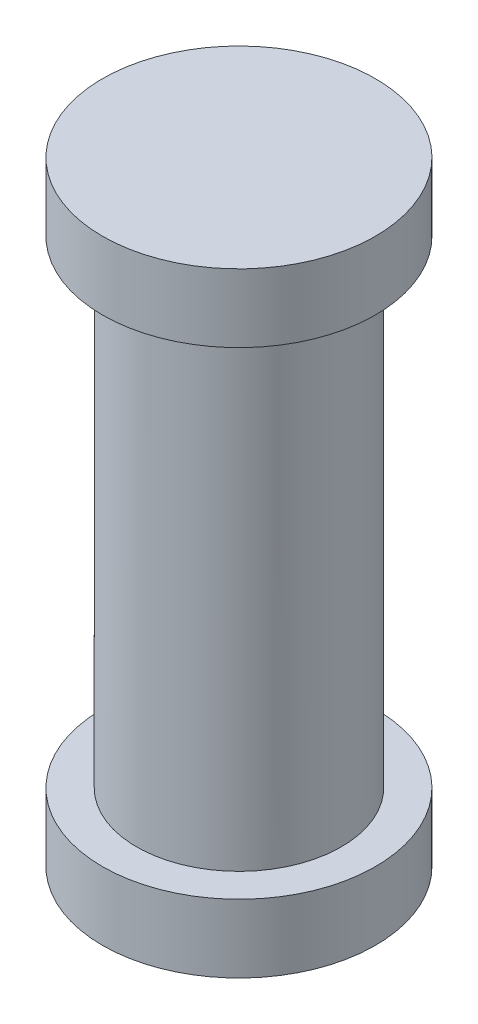
ISO-10303-21;
HEADER;
FILE_DESCRIPTION(('STEP AP214'),'2;1');
FILE_NAME('part.step','',(''),(''),'','','');
FILE_SCHEMA(('AUTOMOTIVE_DESIGN { 1 0 10303 214 1 1 1 1 }'));
ENDSEC;
DATA;
#1=APPLICATION_CONTEXT('core data for automotive mechanical design processes');
#2=APPLICATION_PROTOCOL_DEFINITION('international standard','automotive_design',2000,#1);
#3=PRODUCT_CONTEXT('',#1,'mechanical');
#4=PRODUCT('Part','Part','',(#3));
#5=PRODUCT_RELATED_PRODUCT_CATEGORY('part','',(#4));
#6=PRODUCT_DEFINITION_FORMATION('','',#4);
#7=PRODUCT_DEFINITION_CONTEXT('part definition',#1,'design');
#8=PRODUCT_DEFINITION('design','',#6,#7);
#9=PRODUCT_DEFINITION_SHAPE('','',#8);
#10=(LENGTH_UNIT() NAMED_UNIT(*) SI_UNIT(.MILLI.,.METRE.));
#11=(NAMED_UNIT(*) PLANE_ANGLE_UNIT() SI_UNIT($,.RADIAN.));
#12=(NAMED_UNIT(*) SI_UNIT($,.STERADIAN.) SOLID_ANGLE_UNIT());
#13=UNCERTAINTY_MEASURE_WITH_UNIT(LENGTH_MEASURE(1.E-05),#10,'distance_accuracy_value','');
#14=(GEOMETRIC_REPRESENTATION_CONTEXT(3) GLOBAL_UNCERTAINTY_ASSIGNED_CONTEXT((#13)) GLOBAL_UNIT_ASSIGNED_CONTEXT((#10,
#11,#12)) REPRESENTATION_CONTEXT('',''));
#15=CARTESIAN_POINT('',(0.,0.,0.));
#16=DIRECTION('',(0.,0.,1.));
#17=DIRECTION('',(1.,0.,0.));
#18=AXIS2_PLACEMENT_3D('',#15,#16,#17);
#19=CARTESIAN_POINT('',(0.,7.,0.));
#20=DIRECTION('',(0.,-1.,0.));
#21=DIRECTION('',(0.,0.,-1.));
#22=AXIS2_PLACEMENT_3D('',#19,#20,#21);
#23=CYLINDRICAL_SURFACE('',#22,3.);
#24=CARTESIAN_POINT('',(0.,7.,0.));
#25=DIRECTION('',(0.,1.,0.));
#26=DIRECTION('',(0.,0.,1.));
#27=AXIS2_PLACEMENT_3D('',#24,#25,#26);
#28=CIRCLE('',#27,3.);
#29=CARTESIAN_POINT('',(0.,7.,3.));
#30=VERTEX_POINT('',#29);
#31=EDGE_CURVE('E10',#30,#30,#28,.T.);
#32=ORIENTED_EDGE('',*,*,#31,.F.);
#33=EDGE_LOOP('',(#32));
#34=FACE_BOUND('',#33,.T.);
#35=CARTESIAN_POINT('',(0.,-7.,0.));
#36=DIRECTION('',(0.,-1.,0.));
#37=DIRECTION('',(0.,0.,-1.));
#38=AXIS2_PLACEMENT_3D('',#35,#36,#37);
#39=CIRCLE('',#38,3.);
#40=CARTESIAN_POINT('',(0.,-7.,-3.));
#41=VERTEX_POINT('',#40);
#42=EDGE_CURVE('E46',#41,#41,#39,.T.);
#43=ORIENTED_EDGE('',*,*,#42,.F.);
#44=EDGE_LOOP('',(#43));
#45=FACE_BOUND('',#44,.T.);
#46=ADVANCED_FACE('F31',(#34,#45),#23,.T.);
#47=CARTESIAN_POINT('',(0.,7.,0.));
#48=DIRECTION('',(0.,1.,0.));
#49=DIRECTION('',(0.,0.,1.));
#50=AXIS2_PLACEMENT_3D('',#47,#48,#49);
#51=PLANE('',#50);
#52=CARTESIAN_POINT('',(0.,7.,0.));
#53=DIRECTION('',(0.,1.,0.));
#54=DIRECTION('',(0.,0.,1.));
#55=AXIS2_PLACEMENT_3D('',#52,#53,#54);
#56=CIRCLE('',#55,4.);
#57=CARTESIAN_POINT('',(0.,7.,4.));
#58=VERTEX_POINT('',#57);
#59=EDGE_CURVE('E41',#58,#58,#56,.T.);
#60=ORIENTED_EDGE('',*,*,#59,.F.);
#61=EDGE_LOOP('',(#60));
#62=FACE_BOUND('',#61,.T.);
#63=ORIENTED_EDGE('',*,*,#31,.T.);
#64=EDGE_LOOP('',(#63));
#65=FACE_BOUND('',#64,.T.);
#66=ADVANCED_FACE('F70',(#62,#65),#51,.F.);
#67=CARTESIAN_POINT('',(0.,9.,0.));
#68=DIRECTION('',(0.,-1.,0.));
#69=DIRECTION('',(0.,0.,-1.));
#70=AXIS2_PLACEMENT_3D('',#67,#68,#69);
#71=CYLINDRICAL_SURFACE('',#70,4.);
#72=CARTESIAN_POINT('',(0.,9.,0.));
#73=DIRECTION('',(0.,1.,0.));
#74=DIRECTION('',(0.,0.,1.));
#75=AXIS2_PLACEMENT_3D('',#72,#73,#74);
#76=CIRCLE('',#75,4.);
#77=CARTESIAN_POINT('',(0.,9.,4.));
#78=VERTEX_POINT('',#77);
#79=EDGE_CURVE('E37',#78,#78,#76,.T.);
#80=ORIENTED_EDGE('',*,*,#79,.F.);
#81=EDGE_LOOP('',(#80));
#82=FACE_BOUND('',#81,.T.);
#83=ORIENTED_EDGE('',*,*,#59,.T.);
#84=EDGE_LOOP('',(#83));
#85=FACE_BOUND('',#84,.T.);
#86=ADVANCED_FACE('F75',(#82,#85),#71,.T.);
#87=CARTESIAN_POINT('',(0.,9.,0.));
#88=DIRECTION('',(0.,1.,0.));
#89=DIRECTION('',(0.,0.,1.));
#90=AXIS2_PLACEMENT_3D('',#87,#88,#89);
#91=PLANE('',#90);
#92=ORIENTED_EDGE('',*,*,#79,.T.);
#93=EDGE_LOOP('',(#92));
#94=FACE_BOUND('',#93,.T.);
#95=ADVANCED_FACE('F82',(#94),#91,.T.);
#96=CARTESIAN_POINT('',(0.,-7.,0.));
#97=DIRECTION('',(0.,-1.,0.));
#98=DIRECTION('',(0.,0.,1.));
#99=AXIS2_PLACEMENT_3D('',#96,#97,#98);
#100=PLANE('',#99);
#101=CARTESIAN_POINT('',(0.,-7.,0.));
#102=DIRECTION('',(0.,1.,0.));
#103=DIRECTION('',(0.,0.,1.));
#104=AXIS2_PLACEMENT_3D('',#101,#102,#103);
#105=CIRCLE('',#104,4.);
#106=CARTESIAN_POINT('',(0.,-7.,4.));
#107=VERTEX_POINT('',#106);
#108=EDGE_CURVE('E51',#107,#107,#105,.T.);
#109=ORIENTED_EDGE('',*,*,#108,.T.);
#110=EDGE_LOOP('',(#109));
#111=FACE_BOUND('',#110,.T.);
#112=ORIENTED_EDGE('',*,*,#42,.T.);
#113=EDGE_LOOP('',(#112));
#114=FACE_BOUND('',#113,.T.);
#115=ADVANCED_FACE('F66',(#111,#114),#100,.F.);
#116=CARTESIAN_POINT('',(0.,-9.,0.));
#117=DIRECTION('',(0.,1.,0.));
#118=DIRECTION('',(0.,0.,1.));
#119=AXIS2_PLACEMENT_3D('',#116,#117,#118);
#120=CYLINDRICAL_SURFACE('',#119,4.);
#121=CARTESIAN_POINT('',(0.,-9.,0.));
#122=DIRECTION('',(0.,1.,0.));
#123=DIRECTION('',(0.,0.,1.));
#124=AXIS2_PLACEMENT_3D('',#121,#122,#123);
#125=CIRCLE('',#124,4.);
#126=CARTESIAN_POINT('',(0.,-9.,4.));
#127=VERTEX_POINT('',#126);
#128=EDGE_CURVE('E50',#127,#127,#125,.T.);
#129=ORIENTED_EDGE('',*,*,#128,.T.);
#130=EDGE_LOOP('',(#129));
#131=FACE_BOUND('',#130,.T.);
#132=ORIENTED_EDGE('',*,*,#108,.F.);
#133=EDGE_LOOP('',(#132));
#134=FACE_BOUND('',#133,.T.);
#135=ADVANCED_FACE('F57',(#131,#134),#120,.T.);
#136=CARTESIAN_POINT('',(0.,-9.,0.));
#137=DIRECTION('',(0.,-1.,0.));
#138=DIRECTION('',(0.,0.,1.));
#139=AXIS2_PLACEMENT_3D('',#136,#137,#138);
#140=PLANE('',#139);
#141=ORIENTED_EDGE('',*,*,#128,.F.);
#142=EDGE_LOOP('',(#141));
#143=FACE_BOUND('',#142,.T.);
#144=ADVANCED_FACE('F60',(#143),#140,.T.);
#145=CLOSED_SHELL('',(#46,#66,#86,#95,#115,#135,#144));
#146=MANIFOLD_SOLID_BREP('B2',#145);
#147=ADVANCED_BREP_SHAPE_REPRESENTATION('',(#18,#146),#14);
#148=SHAPE_DEFINITION_REPRESENTATION(#9,#147);
ENDSEC;
END-ISO-10303-21;
